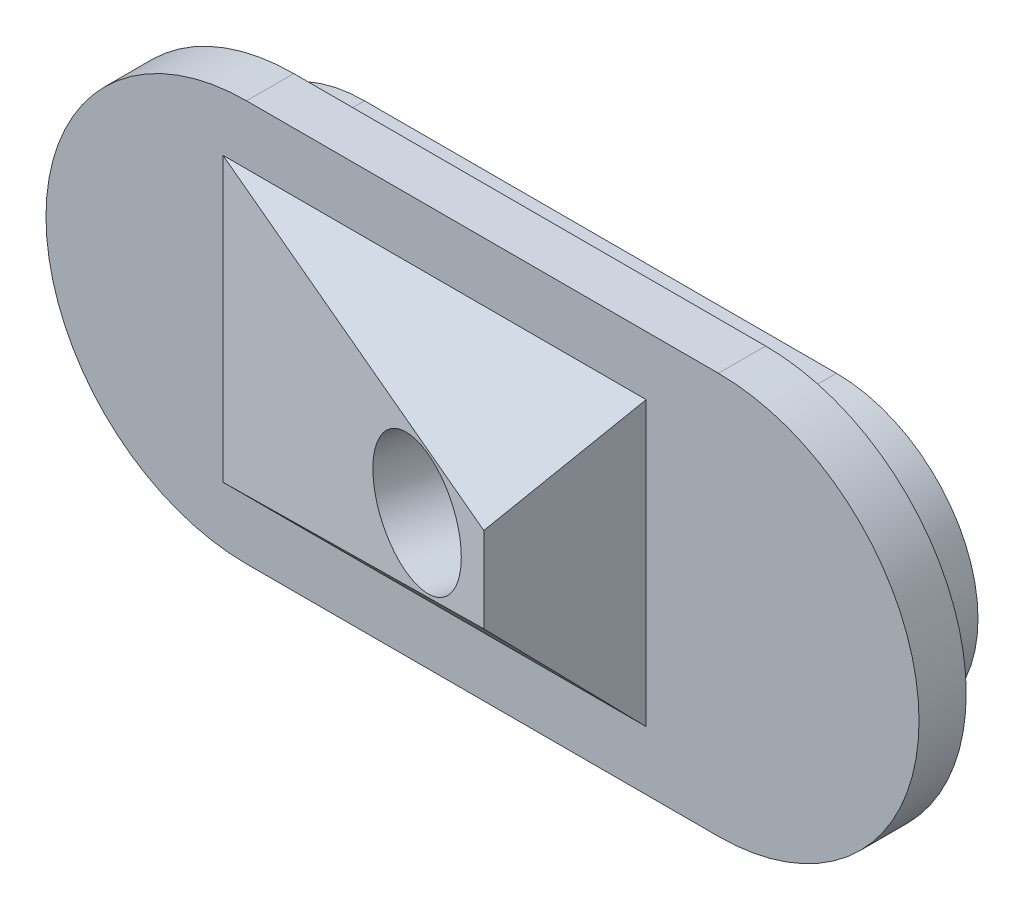
ISO-10303-21;
HEADER;
FILE_DESCRIPTION(('STEP AP214'),'2;1');
FILE_NAME('part.step','',(''),(''),'','','');
FILE_SCHEMA(('AUTOMOTIVE_DESIGN { 1 0 10303 214 1 1 1 1 }'));
ENDSEC;
DATA;
#1=APPLICATION_CONTEXT('core data for automotive mechanical design processes');
#2=APPLICATION_PROTOCOL_DEFINITION('international standard','automotive_design',2000,#1);
#3=PRODUCT_CONTEXT('',#1,'mechanical');
#4=PRODUCT('Part','Part','',(#3));
#5=PRODUCT_RELATED_PRODUCT_CATEGORY('part','',(#4));
#6=PRODUCT_DEFINITION_FORMATION('','',#4);
#7=PRODUCT_DEFINITION_CONTEXT('part definition',#1,'design');
#8=PRODUCT_DEFINITION('design','',#6,#7);
#9=PRODUCT_DEFINITION_SHAPE('','',#8);
#10=(LENGTH_UNIT() NAMED_UNIT(*) SI_UNIT(.MILLI.,.METRE.));
#11=(NAMED_UNIT(*) PLANE_ANGLE_UNIT() SI_UNIT($,.RADIAN.));
#12=(NAMED_UNIT(*) SI_UNIT($,.STERADIAN.) SOLID_ANGLE_UNIT());
#13=UNCERTAINTY_MEASURE_WITH_UNIT(LENGTH_MEASURE(1.E-05),#10,'distance_accuracy_value','');
#14=(GEOMETRIC_REPRESENTATION_CONTEXT(3) GLOBAL_UNCERTAINTY_ASSIGNED_CONTEXT((#13)) GLOBAL_UNIT_ASSIGNED_CONTEXT((#10,
#11,#12)) REPRESENTATION_CONTEXT('',''));
#15=CARTESIAN_POINT('',(0.,0.,0.));
#16=DIRECTION('',(0.,0.,1.));
#17=DIRECTION('',(1.,0.,0.));
#18=AXIS2_PLACEMENT_3D('',#15,#16,#17);
#19=CARTESIAN_POINT('',(-10.,0.,5.));
#20=DIRECTION('',(0.,0.,-1.));
#21=DIRECTION('',(-1.,0.,0.));
#22=AXIS2_PLACEMENT_3D('',#19,#20,#21);
#23=CYLINDRICAL_SURFACE('',#22,6.);
#24=DIRECTION('',(0.,0.,-1.));
#25=VECTOR('',#24,1.);
#26=CARTESIAN_POINT('',(-10.,6.00000000000001,5.));
#27=LINE('',#26,#25);
#28=CARTESIAN_POINT('',(-10.,6.00000000000001,3.));
#29=VERTEX_POINT('',#28);
#30=CARTESIAN_POINT('',(-10.,6.00000000000001,0.));
#31=VERTEX_POINT('',#30);
#32=EDGE_CURVE('E170',#29,#31,#27,.T.);
#33=ORIENTED_EDGE('',*,*,#32,.T.);
#34=CARTESIAN_POINT('',(-10.,0.,0.));
#35=DIRECTION('',(0.,0.,1.));
#36=DIRECTION('',(1.,0.,0.));
#37=AXIS2_PLACEMENT_3D('',#34,#35,#36);
#38=CIRCLE('',#37,6.);
#39=CARTESIAN_POINT('',(-10.,-5.99999999999999,0.));
#40=VERTEX_POINT('',#39);
#41=EDGE_CURVE('E364',#31,#40,#38,.T.);
#42=ORIENTED_EDGE('',*,*,#41,.T.);
#43=DIRECTION('',(0.,0.,-1.));
#44=VECTOR('',#43,1.);
#45=CARTESIAN_POINT('',(-10.,-5.99999999999999,5.));
#46=LINE('',#45,#44);
#47=CARTESIAN_POINT('',(-10.,-5.99999999999999,3.));
#48=VERTEX_POINT('',#47);
#49=EDGE_CURVE('E155',#48,#40,#46,.T.);
#50=ORIENTED_EDGE('',*,*,#49,.F.);
#51=CARTESIAN_POINT('',(-10.,0.,3.));
#52=DIRECTION('',(0.,0.,1.));
#53=DIRECTION('',(1.,0.,0.));
#54=AXIS2_PLACEMENT_3D('',#51,#52,#53);
#55=CIRCLE('',#54,6.);
#56=EDGE_CURVE('E148',#29,#48,#55,.T.);
#57=ORIENTED_EDGE('',*,*,#56,.F.);
#58=EDGE_LOOP('',(#33,#42,#50,#57));
#59=FACE_BOUND('',#58,.T.);
#60=ADVANCED_FACE('F49',(#59),#23,.T.);
#61=CARTESIAN_POINT('',(-10.,-5.99999999999999,5.));
#62=DIRECTION('',(0.,1.,0.));
#63=DIRECTION('',(0.,0.,1.));
#64=AXIS2_PLACEMENT_3D('',#61,#62,#63);
#65=PLANE('',#64);
#66=ORIENTED_EDGE('',*,*,#49,.T.);
#67=DIRECTION('',(1.,0.,0.));
#68=VECTOR('',#67,1.);
#69=CARTESIAN_POINT('',(-10.,-5.99999999999999,0.));
#70=LINE('',#69,#68);
#71=CARTESIAN_POINT('',(10.,-6.,0.));
#72=VERTEX_POINT('',#71);
#73=EDGE_CURVE('E371',#40,#72,#70,.T.);
#74=ORIENTED_EDGE('',*,*,#73,.T.);
#75=DIRECTION('',(0.,0.,-1.));
#76=VECTOR('',#75,1.);
#77=CARTESIAN_POINT('',(10.,-6.,5.));
#78=LINE('',#77,#76);
#79=CARTESIAN_POINT('',(10.,-6.,3.));
#80=VERTEX_POINT('',#79);
#81=EDGE_CURVE('E163',#80,#72,#78,.T.);
#82=ORIENTED_EDGE('',*,*,#81,.F.);
#83=DIRECTION('',(1.,0.,0.));
#84=VECTOR('',#83,1.);
#85=CARTESIAN_POINT('',(-10.,-5.99999999999999,3.));
#86=LINE('',#85,#84);
#87=EDGE_CURVE('E378',#48,#80,#86,.T.);
#88=ORIENTED_EDGE('',*,*,#87,.F.);
#89=EDGE_LOOP('',(#66,#74,#82,#88));
#90=FACE_BOUND('',#89,.T.);
#91=ADVANCED_FACE('F200',(#90),#65,.F.);
#92=CARTESIAN_POINT('',(10.,0.,5.));
#93=DIRECTION('',(0.,0.,-1.));
#94=DIRECTION('',(-1.,0.,0.));
#95=AXIS2_PLACEMENT_3D('',#92,#93,#94);
#96=CYLINDRICAL_SURFACE('',#95,6.);
#97=ORIENTED_EDGE('',*,*,#81,.T.);
#98=CARTESIAN_POINT('',(10.,0.,0.));
#99=DIRECTION('',(0.,0.,1.));
#100=DIRECTION('',(1.,0.,0.));
#101=AXIS2_PLACEMENT_3D('',#98,#99,#100);
#102=CIRCLE('',#101,6.);
#103=CARTESIAN_POINT('',(10.,6.00000000000001,0.));
#104=VERTEX_POINT('',#103);
#105=EDGE_CURVE('E361',#72,#104,#102,.T.);
#106=ORIENTED_EDGE('',*,*,#105,.T.);
#107=DIRECTION('',(0.,0.,-1.));
#108=VECTOR('',#107,1.);
#109=CARTESIAN_POINT('',(10.,6.00000000000001,5.));
#110=LINE('',#109,#108);
#111=CARTESIAN_POINT('',(10.,6.00000000000001,3.));
#112=VERTEX_POINT('',#111);
#113=EDGE_CURVE('E174',#112,#104,#110,.T.);
#114=ORIENTED_EDGE('',*,*,#113,.F.);
#115=CARTESIAN_POINT('',(10.,0.,3.));
#116=DIRECTION('',(0.,0.,1.));
#117=DIRECTION('',(1.,0.,0.));
#118=AXIS2_PLACEMENT_3D('',#115,#116,#117);
#119=CIRCLE('',#118,6.);
#120=EDGE_CURVE('E377',#80,#112,#119,.T.);
#121=ORIENTED_EDGE('',*,*,#120,.F.);
#122=EDGE_LOOP('',(#97,#106,#114,#121));
#123=FACE_BOUND('',#122,.T.);
#124=ADVANCED_FACE('F206',(#123),#96,.T.);
#125=CARTESIAN_POINT('',(-10.,6.00000000000001,5.));
#126=DIRECTION('',(0.,-1.,0.));
#127=DIRECTION('',(1.,0.,0.));
#128=AXIS2_PLACEMENT_3D('',#125,#126,#127);
#129=PLANE('',#128);
#130=ORIENTED_EDGE('',*,*,#113,.T.);
#131=DIRECTION('',(-1.,0.,0.));
#132=VECTOR('',#131,1.);
#133=CARTESIAN_POINT('',(-10.,6.00000000000001,0.));
#134=LINE('',#133,#132);
#135=EDGE_CURVE('E184',#104,#31,#134,.T.);
#136=ORIENTED_EDGE('',*,*,#135,.T.);
#137=ORIENTED_EDGE('',*,*,#32,.F.);
#138=DIRECTION('',(-1.,0.,0.));
#139=VECTOR('',#138,1.);
#140=CARTESIAN_POINT('',(-10.,6.00000000000001,3.));
#141=LINE('',#140,#139);
#142=EDGE_CURVE('E154',#112,#29,#141,.T.);
#143=ORIENTED_EDGE('',*,*,#142,.F.);
#144=EDGE_LOOP('',(#130,#136,#137,#143));
#145=FACE_BOUND('',#144,.T.);
#146=ADVANCED_FACE('F212',(#145),#129,.F.);
#147=CARTESIAN_POINT('',(-10.,0.,3.));
#148=DIRECTION('',(0.,0.,1.));
#149=DIRECTION('',(1.,0.,0.));
#150=AXIS2_PLACEMENT_3D('',#147,#148,#149);
#151=PLANE('',#150);
#152=CARTESIAN_POINT('',(-10.,0.,3.));
#153=DIRECTION('',(0.,0.,1.));
#154=DIRECTION('',(1.,0.,0.));
#155=AXIS2_PLACEMENT_3D('',#152,#153,#154);
#156=CIRCLE('',#155,8.5);
#157=CARTESIAN_POINT('',(-10.,8.50000000000001,3.));
#158=VERTEX_POINT('',#157);
#159=CARTESIAN_POINT('',(-10.,-8.49999999999999,3.));
#160=VERTEX_POINT('',#159);
#161=EDGE_CURVE('E401',#158,#160,#156,.T.);
#162=ORIENTED_EDGE('',*,*,#161,.F.);
#163=DIRECTION('',(-1.,0.,0.));
#164=VECTOR('',#163,1.);
#165=CARTESIAN_POINT('',(-10.,8.50000000000001,3.));
#166=LINE('',#165,#164);
#167=CARTESIAN_POINT('',(10.,8.50000000000001,3.));
#168=VERTEX_POINT('',#167);
#169=EDGE_CURVE('E392',#168,#158,#166,.T.);
#170=ORIENTED_EDGE('',*,*,#169,.F.);
#171=CARTESIAN_POINT('',(10.,0.,3.));
#172=DIRECTION('',(0.,0.,1.));
#173=DIRECTION('',(1.,0.,0.));
#174=AXIS2_PLACEMENT_3D('',#171,#172,#173);
#175=CIRCLE('',#174,8.5);
#176=CARTESIAN_POINT('',(10.,-8.49999999999999,3.));
#177=VERTEX_POINT('',#176);
#178=EDGE_CURVE('E417',#177,#168,#175,.T.);
#179=ORIENTED_EDGE('',*,*,#178,.F.);
#180=DIRECTION('',(1.,0.,0.));
#181=VECTOR('',#180,1.);
#182=CARTESIAN_POINT('',(-10.,-8.49999999999999,3.));
#183=LINE('',#182,#181);
#184=EDGE_CURVE('E421',#160,#177,#183,.T.);
#185=ORIENTED_EDGE('',*,*,#184,.F.);
#186=EDGE_LOOP('',(#162,#170,#179,#185));
#187=FACE_BOUND('',#186,.T.);
#188=ORIENTED_EDGE('',*,*,#142,.T.);
#189=ORIENTED_EDGE('',*,*,#56,.T.);
#190=ORIENTED_EDGE('',*,*,#87,.T.);
#191=ORIENTED_EDGE('',*,*,#120,.T.);
#192=EDGE_LOOP('',(#188,#189,#190,#191));
#193=FACE_BOUND('',#192,.T.);
#194=ADVANCED_FACE('F216',(#187,#193),#151,.F.);
#195=CARTESIAN_POINT('',(-10.,0.,3.));
#196=DIRECTION('',(0.,0.,1.));
#197=DIRECTION('',(1.,0.,0.));
#198=AXIS2_PLACEMENT_3D('',#195,#196,#197);
#199=CYLINDRICAL_SURFACE('',#198,8.5);
#200=CARTESIAN_POINT('',(-10.,0.,5.));
#201=DIRECTION('',(0.,0.,1.));
#202=DIRECTION('',(1.,0.,0.));
#203=AXIS2_PLACEMENT_3D('',#200,#201,#202);
#204=CIRCLE('',#203,8.5);
#205=CARTESIAN_POINT('',(-10.,8.50000000000001,5.));
#206=VERTEX_POINT('',#205);
#207=CARTESIAN_POINT('',(-10.,-8.49999999999999,5.));
#208=VERTEX_POINT('',#207);
#209=EDGE_CURVE('E410',#206,#208,#204,.T.);
#210=ORIENTED_EDGE('',*,*,#209,.F.);
#211=DIRECTION('',(0.,0.,1.));
#212=VECTOR('',#211,1.);
#213=CARTESIAN_POINT('',(-10.,8.50000000000001,3.));
#214=LINE('',#213,#212);
#215=EDGE_CURVE('E380',#158,#206,#214,.T.);
#216=ORIENTED_EDGE('',*,*,#215,.F.);
#217=ORIENTED_EDGE('',*,*,#161,.T.);
#218=DIRECTION('',(0.,0.,1.));
#219=VECTOR('',#218,1.);
#220=CARTESIAN_POINT('',(-10.,-8.49999999999999,3.));
#221=LINE('',#220,#219);
#222=EDGE_CURVE('E387',#160,#208,#221,.T.);
#223=ORIENTED_EDGE('',*,*,#222,.T.);
#224=EDGE_LOOP('',(#210,#216,#217,#223));
#225=FACE_BOUND('',#224,.T.);
#226=ADVANCED_FACE('F225',(#225),#199,.T.);
#227=CARTESIAN_POINT('',(-10.,8.50000000000001,3.));
#228=DIRECTION('',(0.,1.,0.));
#229=DIRECTION('',(0.,0.,1.));
#230=AXIS2_PLACEMENT_3D('',#227,#228,#229);
#231=PLANE('',#230);
#232=DIRECTION('',(-1.,0.,0.));
#233=VECTOR('',#232,1.);
#234=CARTESIAN_POINT('',(-10.,8.50000000000001,5.));
#235=LINE('',#234,#233);
#236=CARTESIAN_POINT('',(10.,8.50000000000001,5.));
#237=VERTEX_POINT('',#236);
#238=EDGE_CURVE('E397',#237,#206,#235,.T.);
#239=ORIENTED_EDGE('',*,*,#238,.F.);
#240=DIRECTION('',(0.,0.,1.));
#241=VECTOR('',#240,1.);
#242=CARTESIAN_POINT('',(10.,8.50000000000001,3.));
#243=LINE('',#242,#241);
#244=EDGE_CURVE('E384',#168,#237,#243,.T.);
#245=ORIENTED_EDGE('',*,*,#244,.F.);
#246=ORIENTED_EDGE('',*,*,#169,.T.);
#247=ORIENTED_EDGE('',*,*,#215,.T.);
#248=EDGE_LOOP('',(#239,#245,#246,#247));
#249=FACE_BOUND('',#248,.T.);
#250=ADVANCED_FACE('F228',(#249),#231,.T.);
#251=CARTESIAN_POINT('',(10.,0.,3.));
#252=DIRECTION('',(0.,0.,1.));
#253=DIRECTION('',(1.,0.,0.));
#254=AXIS2_PLACEMENT_3D('',#251,#252,#253);
#255=CYLINDRICAL_SURFACE('',#254,8.5);
#256=CARTESIAN_POINT('',(10.,0.,5.));
#257=DIRECTION('',(0.,0.,1.));
#258=DIRECTION('',(1.,0.,0.));
#259=AXIS2_PLACEMENT_3D('',#256,#257,#258);
#260=CIRCLE('',#259,8.5);
#261=CARTESIAN_POINT('',(10.,-8.49999999999999,5.));
#262=VERTEX_POINT('',#261);
#263=EDGE_CURVE('E402',#262,#237,#260,.T.);
#264=ORIENTED_EDGE('',*,*,#263,.F.);
#265=DIRECTION('',(0.,0.,1.));
#266=VECTOR('',#265,1.);
#267=CARTESIAN_POINT('',(10.,-8.49999999999999,3.));
#268=LINE('',#267,#266);
#269=EDGE_CURVE('E391',#177,#262,#268,.T.);
#270=ORIENTED_EDGE('',*,*,#269,.F.);
#271=ORIENTED_EDGE('',*,*,#178,.T.);
#272=ORIENTED_EDGE('',*,*,#244,.T.);
#273=EDGE_LOOP('',(#264,#270,#271,#272));
#274=FACE_BOUND('',#273,.T.);
#275=ADVANCED_FACE('F231',(#274),#255,.T.);
#276=CARTESIAN_POINT('',(-10.,-8.49999999999999,3.));
#277=DIRECTION('',(0.,-1.,0.));
#278=DIRECTION('',(0.,0.,-1.));
#279=AXIS2_PLACEMENT_3D('',#276,#277,#278);
#280=PLANE('',#279);
#281=DIRECTION('',(1.,0.,0.));
#282=VECTOR('',#281,1.);
#283=CARTESIAN_POINT('',(-10.,-8.49999999999999,5.));
#284=LINE('',#283,#282);
#285=EDGE_CURVE('E406',#208,#262,#284,.T.);
#286=ORIENTED_EDGE('',*,*,#285,.F.);
#287=ORIENTED_EDGE('',*,*,#222,.F.);
#288=ORIENTED_EDGE('',*,*,#184,.T.);
#289=ORIENTED_EDGE('',*,*,#269,.T.);
#290=EDGE_LOOP('',(#286,#287,#288,#289));
#291=FACE_BOUND('',#290,.T.);
#292=ADVANCED_FACE('F223',(#291),#280,.T.);
#293=CARTESIAN_POINT('',(-11.,24.6349712473815,5.));
#294=DIRECTION('',(0.258819045102514,0.,-0.96592582628907));
#295=DIRECTION('',(-0.96592582628907,0.,-0.258819045102514));
#296=AXIS2_PLACEMENT_3D('',#293,#294,#295);
#297=PLANE('',#296);
#298=CARTESIAN_POINT('',(0.238519215976511,0.,8.01135214804248));
#299=DIRECTION('',(-0.258819045102514,0.,0.96592582628907));
#300=DIRECTION('',(0.96592582628907,0.,0.258819045102514));
#301=AXIS2_PLACEMENT_3D('',#298,#299,#300);
#302=CIRCLE('',#301,2.65);
#303=CARTESIAN_POINT('',(2.79822265564255,0.,8.69722261756414));
#304=VERTEX_POINT('',#303);
#305=EDGE_CURVE('E413',#304,#304,#302,.T.);
#306=ORIENTED_EDGE('',*,*,#305,.F.);
#307=EDGE_LOOP('',(#306));
#308=FACE_BOUND('',#307,.T.);
#309=DIRECTION('',(0.932927859761487,0.259146627711524,0.249977266619579));
#310=VECTOR('',#309,1.);
#311=CARTESIAN_POINT('',(-3.59353284466075,-3.94264801240576,6.98455689304073));
#312=LINE('',#311,#310);
#313=CARTESIAN_POINT('',(-11.,-5.99999999999999,5.));
#314=VERTEX_POINT('',#313);
#315=CARTESIAN_POINT('',(4.10222252113276,-1.80493818857423,9.04662832845253));
#316=VERTEX_POINT('',#315);
#317=EDGE_CURVE('E141',#314,#316,#312,.T.);
#318=ORIENTED_EDGE('',*,*,#317,.T.);
#319=DIRECTION('',(0.,1.,0.));
#320=VECTOR('',#319,1.);
#321=CARTESIAN_POINT('',(4.10222252113276,24.6349712473815,9.04662832845253));
#322=LINE('',#321,#320);
#323=CARTESIAN_POINT('',(4.10222252113276,1.80493818857424,9.04662832845253));
#324=VERTEX_POINT('',#323);
#325=EDGE_CURVE('E138',#316,#324,#322,.T.);
#326=ORIENTED_EDGE('',*,*,#325,.T.);
#327=DIRECTION('',(-0.932927859761487,0.259146627711524,-0.249977266619579));
#328=VECTOR('',#327,1.);
#329=CARTESIAN_POINT('',(-15.5052858502754,7.25146829174318,3.79281229474737));
#330=LINE('',#329,#328);
#331=CARTESIAN_POINT('',(-11.,6.00000000000001,5.));
#332=VERTEX_POINT('',#331);
#333=EDGE_CURVE('E132',#324,#332,#330,.T.);
#334=ORIENTED_EDGE('',*,*,#333,.T.);
#335=DIRECTION('',(0.,-1.,0.));
#336=VECTOR('',#335,1.);
#337=CARTESIAN_POINT('',(-11.,24.6349712473815,5.));
#338=LINE('',#337,#336);
#339=EDGE_CURVE('E136',#332,#314,#338,.T.);
#340=ORIENTED_EDGE('',*,*,#339,.T.);
#341=EDGE_LOOP('',(#318,#326,#334,#340));
#342=FACE_BOUND('',#341,.T.);
#343=ADVANCED_FACE('F134',(#308,#342),#297,.F.);
#344=CARTESIAN_POINT('',(-10.,0.,5.));
#345=DIRECTION('',(0.,0.,1.));
#346=DIRECTION('',(1.,0.,0.));
#347=AXIS2_PLACEMENT_3D('',#344,#345,#346);
#348=PLANE('',#347);
#349=ORIENTED_EDGE('',*,*,#339,.F.);
#350=DIRECTION('',(1.,0.,0.));
#351=VECTOR('',#350,1.);
#352=CARTESIAN_POINT('',(7.,6.00000000000001,5.));
#353=LINE('',#352,#351);
#354=CARTESIAN_POINT('',(6.93570218104811,6.00000000000001,5.));
#355=VERTEX_POINT('',#354);
#356=EDGE_CURVE('E143',#332,#355,#353,.T.);
#357=ORIENTED_EDGE('',*,*,#356,.T.);
#358=DIRECTION('',(0.,1.,0.));
#359=VECTOR('',#358,1.);
#360=CARTESIAN_POINT('',(6.93570218104811,24.6349712473815,5.));
#361=LINE('',#360,#359);
#362=CARTESIAN_POINT('',(6.93570218104811,-5.99999999999999,5.));
#363=VERTEX_POINT('',#362);
#364=EDGE_CURVE('E11',#355,#363,#361,.F.);
#365=ORIENTED_EDGE('',*,*,#364,.T.);
#366=DIRECTION('',(1.,0.,0.));
#367=VECTOR('',#366,1.);
#368=CARTESIAN_POINT('',(7.,-5.99999999999999,5.));
#369=LINE('',#368,#367);
#370=EDGE_CURVE('E147',#314,#363,#369,.T.);
#371=ORIENTED_EDGE('',*,*,#370,.F.);
#372=EDGE_LOOP('',(#349,#357,#365,#371));
#373=FACE_BOUND('',#372,.T.);
#374=ORIENTED_EDGE('',*,*,#209,.T.);
#375=ORIENTED_EDGE('',*,*,#285,.T.);
#376=ORIENTED_EDGE('',*,*,#263,.T.);
#377=ORIENTED_EDGE('',*,*,#238,.T.);
#378=EDGE_LOOP('',(#374,#375,#376,#377));
#379=FACE_BOUND('',#378,.T.);
#380=ADVANCED_FACE('F150',(#373,#379),#348,.T.);
#381=CARTESIAN_POINT('',(5.92041587609588,0.,-13.1937748708795));
#382=DIRECTION('',(-0.258819045102514,0.,0.96592582628907));
#383=DIRECTION('',(0.96592582628907,0.,0.258819045102514));
#384=AXIS2_PLACEMENT_3D('',#381,#382,#383);
#385=CYLINDRICAL_SURFACE('',#384,2.65);
#386=CARTESIAN_POINT('',(2.38515455432578,0.,0.));
#387=DIRECTION('',(0.,0.,1.));
#388=DIRECTION('',(-1.,0.,0.));
#389=AXIS2_PLACEMENT_3D('',#386,#387,#388);
#390=ELLIPSE('',#389,2.74348187808671,2.65);
#391=CARTESIAN_POINT('',(-0.358327323760938,0.,0.));
#392=VERTEX_POINT('',#391);
#393=EDGE_CURVE('E140',#392,#392,#390,.F.);
#394=ORIENTED_EDGE('',*,*,#393,.T.);
#395=EDGE_LOOP('',(#394));
#396=FACE_BOUND('',#395,.T.);
#397=ORIENTED_EDGE('',*,*,#305,.T.);
#398=EDGE_LOOP('',(#397));
#399=FACE_BOUND('',#398,.T.);
#400=ADVANCED_FACE('F220',(#396,#399),#385,.F.);
#401=CARTESIAN_POINT('',(-32.1911426684633,-32.5,0.));
#402=DIRECTION('',(0.,0.,1.));
#403=DIRECTION('',(1.,0.,0.));
#404=AXIS2_PLACEMENT_3D('',#401,#402,#403);
#405=PLANE('',#404);
#406=ORIENTED_EDGE('',*,*,#393,.F.);
#407=EDGE_LOOP('',(#406));
#408=FACE_BOUND('',#407,.T.);
#409=ORIENTED_EDGE('',*,*,#135,.F.);
#410=ORIENTED_EDGE('',*,*,#105,.F.);
#411=ORIENTED_EDGE('',*,*,#73,.F.);
#412=ORIENTED_EDGE('',*,*,#41,.F.);
#413=EDGE_LOOP('',(#409,#410,#411,#412));
#414=FACE_BOUND('',#413,.T.);
#415=ADVANCED_FACE('F244',(#408,#414),#405,.F.);
#416=CARTESIAN_POINT('',(-18.5,-0.999999999999994,9.82308546376008));
#417=DIRECTION('',(0.,0.694259146012448,-0.719725112927196));
#418=DIRECTION('',(0.,0.719725112927197,0.694259146012449));
#419=AXIS2_PLACEMENT_3D('',#416,#417,#418);
#420=PLANE('',#419);
#421=ORIENTED_EDGE('',*,*,#370,.T.);
#422=DIRECTION('',(0.437203165109822,-0.647293971343165,-0.624390828792951));
#423=VECTOR('',#422,1.);
#424=CARTESIAN_POINT('',(-1.69660551181419,6.78042149343871,17.3282130251462));
#425=LINE('',#424,#423);
#426=EDGE_CURVE('E160',#363,#316,#425,.F.);
#427=ORIENTED_EDGE('',*,*,#426,.T.);
#428=ORIENTED_EDGE('',*,*,#317,.F.);
#429=EDGE_LOOP('',(#421,#427,#428));
#430=FACE_BOUND('',#429,.T.);
#431=ADVANCED_FACE('F191',(#430),#420,.F.);
#432=CARTESIAN_POINT('',(-18.5,6.00000000000001,5.));
#433=DIRECTION('',(0.,-0.694259146012448,-0.719725112927197));
#434=DIRECTION('',(0.,0.719725112927197,-0.694259146012448));
#435=AXIS2_PLACEMENT_3D('',#432,#433,#434);
#436=PLANE('',#435);
#437=ORIENTED_EDGE('',*,*,#333,.F.);
#438=DIRECTION('',(-0.437203165109822,-0.647293971343165,0.624390828792951));
#439=VECTOR('',#438,1.);
#440=CARTESIAN_POINT('',(12.2467376153394,13.8631663550358,-2.58494466922007));
#441=LINE('',#440,#439);
#442=EDGE_CURVE('E59',#324,#355,#441,.F.);
#443=ORIENTED_EDGE('',*,*,#442,.T.);
#444=ORIENTED_EDGE('',*,*,#356,.F.);
#445=EDGE_LOOP('',(#437,#443,#444));
#446=FACE_BOUND('',#445,.T.);
#447=ADVANCED_FACE('F144',(#446),#436,.F.);
#448=CARTESIAN_POINT('',(7.,24.6349712473815,4.90817319802598));
#449=DIRECTION('',(-0.819152044288998,0.,-0.573576436351037));
#450=DIRECTION('',(0.,-1.,0.));
#451=AXIS2_PLACEMENT_3D('',#448,#449,#450);
#452=PLANE('',#451);
#453=ORIENTED_EDGE('',*,*,#442,.F.);
#454=ORIENTED_EDGE('',*,*,#325,.F.);
#455=ORIENTED_EDGE('',*,*,#426,.F.);
#456=ORIENTED_EDGE('',*,*,#364,.F.);
#457=EDGE_LOOP('',(#453,#454,#455,#456));
#458=FACE_BOUND('',#457,.T.);
#459=ADVANCED_FACE('F52',(#458),#452,.F.);
#460=CLOSED_SHELL('',(#60,#91,#124,#146,#194,#226,#250,#275,#292,#343,#380,#400,#415,#431,#447,#459));
#461=MANIFOLD_SOLID_BREP('B2',#460);
#462=ADVANCED_BREP_SHAPE_REPRESENTATION('',(#18,#461),#14);
#463=SHAPE_DEFINITION_REPRESENTATION(#9,#462);
ENDSEC;
END-ISO-10303-21;
